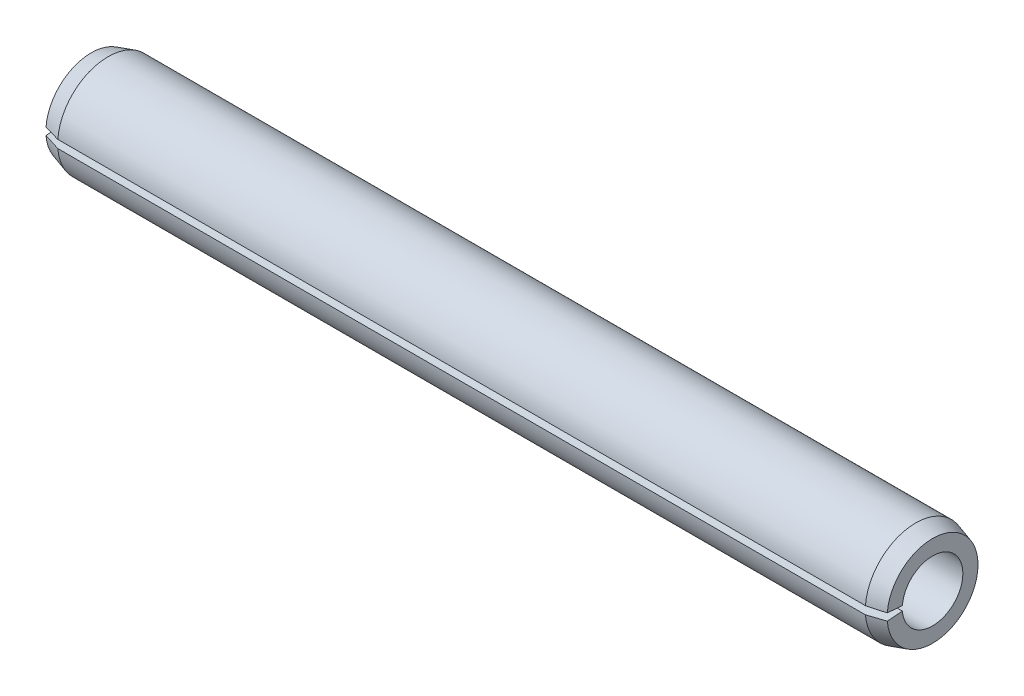
ISO-10303-21;
HEADER;
FILE_DESCRIPTION(('STEP AP214'),'2;1');
FILE_NAME('part.step','',(''),(''),'','','');
FILE_SCHEMA(('AUTOMOTIVE_DESIGN { 1 0 10303 214 1 1 1 1 }'));
ENDSEC;
DATA;
#1=APPLICATION_CONTEXT('core data for automotive mechanical design processes');
#2=APPLICATION_PROTOCOL_DEFINITION('international standard','automotive_design',2000,#1);
#3=PRODUCT_CONTEXT('',#1,'mechanical');
#4=PRODUCT('Part','Part','',(#3));
#5=PRODUCT_RELATED_PRODUCT_CATEGORY('part','',(#4));
#6=PRODUCT_DEFINITION_FORMATION('','',#4);
#7=PRODUCT_DEFINITION_CONTEXT('part definition',#1,'design');
#8=PRODUCT_DEFINITION('design','',#6,#7);
#9=PRODUCT_DEFINITION_SHAPE('','',#8);
#10=(LENGTH_UNIT() NAMED_UNIT(*) SI_UNIT(.MILLI.,.METRE.));
#11=(NAMED_UNIT(*) PLANE_ANGLE_UNIT() SI_UNIT($,.RADIAN.));
#12=(NAMED_UNIT(*) SI_UNIT($,.STERADIAN.) SOLID_ANGLE_UNIT());
#13=UNCERTAINTY_MEASURE_WITH_UNIT(LENGTH_MEASURE(1.E-05),#10,'distance_accuracy_value','');
#14=(GEOMETRIC_REPRESENTATION_CONTEXT(3) GLOBAL_UNCERTAINTY_ASSIGNED_CONTEXT((#13)) GLOBAL_UNIT_ASSIGNED_CONTEXT((#10,
#11,#12)) REPRESENTATION_CONTEXT('',''));
#15=CARTESIAN_POINT('',(0.,0.,0.));
#16=DIRECTION('',(0.,0.,1.));
#17=DIRECTION('',(1.,0.,0.));
#18=AXIS2_PLACEMENT_3D('',#15,#16,#17);
#19=CARTESIAN_POINT('',(0.,1.35,0.));
#20=DIRECTION('',(1.,0.,0.));
#21=DIRECTION('',(0.,0.,-1.));
#22=AXIS2_PLACEMENT_3D('',#19,#20,#21);
#23=PLANE('',#22);
#24=DIRECTION('',(0.,0.0784590957278456,0.996917333733128));
#25=VECTOR('',#24,1.);
#26=CARTESIAN_POINT('',(0.,0.,0.));
#27=LINE('',#26,#25);
#28=CARTESIAN_POINT('',(0.,0.070613186155061,0.897225600359815));
#29=VERTEX_POINT('',#28);
#30=CARTESIAN_POINT('',(0.,0.105919779232592,1.34583840053972));
#31=VERTEX_POINT('',#30);
#32=EDGE_CURVE('E82',#29,#31,#27,.T.);
#33=ORIENTED_EDGE('',*,*,#32,.T.);
#34=CARTESIAN_POINT('',(0.,0.,0.));
#35=DIRECTION('',(-1.,0.,0.));
#36=DIRECTION('',(0.,0.,1.));
#37=AXIS2_PLACEMENT_3D('',#34,#35,#36);
#38=CIRCLE('',#37,1.35);
#39=CARTESIAN_POINT('',(0.,-0.105919779232592,1.34583840053972));
#40=VERTEX_POINT('',#39);
#41=EDGE_CURVE('E100',#31,#40,#38,.T.);
#42=ORIENTED_EDGE('',*,*,#41,.T.);
#43=DIRECTION('',(0.,-0.0784590957278456,0.996917333733128));
#44=VECTOR('',#43,1.);
#45=CARTESIAN_POINT('',(0.,0.,0.));
#46=LINE('',#45,#44);
#47=CARTESIAN_POINT('',(0.,-0.070613186155061,0.897225600359815));
#48=VERTEX_POINT('',#47);
#49=EDGE_CURVE('E54',#48,#40,#46,.T.);
#50=ORIENTED_EDGE('',*,*,#49,.F.);
#51=CARTESIAN_POINT('',(0.,0.,0.));
#52=DIRECTION('',(-1.,0.,0.));
#53=DIRECTION('',(0.,0.,1.));
#54=AXIS2_PLACEMENT_3D('',#51,#52,#53);
#55=CIRCLE('',#54,0.9);
#56=EDGE_CURVE('E97',#29,#48,#55,.T.);
#57=ORIENTED_EDGE('',*,*,#56,.F.);
#58=EDGE_LOOP('',(#33,#42,#50,#57));
#59=FACE_BOUND('',#58,.T.);
#60=ADVANCED_FACE('F33',(#59),#23,.F.);
#61=CARTESIAN_POINT('',(-9.52499999999999,0.,0.));
#62=DIRECTION('',(-1.,0.,0.));
#63=DIRECTION('',(0.,0.,1.));
#64=AXIS2_PLACEMENT_3D('',#61,#62,#63);
#65=CYLINDRICAL_SURFACE('',#64,0.9);
#66=DIRECTION('',(-1.,0.,0.));
#67=VECTOR('',#66,1.);
#68=CARTESIAN_POINT('',(-9.52499999999999,0.070613186155061,0.897225600359815));
#69=LINE('',#68,#67);
#70=CARTESIAN_POINT('',(25.,0.070613186155061,0.897225600359815));
#71=VERTEX_POINT('',#70);
#72=EDGE_CURVE('E85',#29,#71,#69,.F.);
#73=ORIENTED_EDGE('',*,*,#72,.F.);
#74=ORIENTED_EDGE('',*,*,#56,.T.);
#75=DIRECTION('',(-1.,0.,0.));
#76=VECTOR('',#75,1.);
#77=CARTESIAN_POINT('',(-9.52499999999999,-0.070613186155061,0.897225600359815));
#78=LINE('',#77,#76);
#79=CARTESIAN_POINT('',(25.,-0.070613186155061,0.897225600359815));
#80=VERTEX_POINT('',#79);
#81=EDGE_CURVE('E118',#48,#80,#78,.F.);
#82=ORIENTED_EDGE('',*,*,#81,.T.);
#83=CARTESIAN_POINT('',(25.,0.,0.));
#84=DIRECTION('',(-1.,0.,0.));
#85=DIRECTION('',(0.,0.,1.));
#86=AXIS2_PLACEMENT_3D('',#83,#84,#85);
#87=CIRCLE('',#86,0.9);
#88=EDGE_CURVE('E99',#71,#80,#87,.T.);
#89=ORIENTED_EDGE('',*,*,#88,.F.);
#90=EDGE_LOOP('',(#73,#74,#82,#89));
#91=FACE_BOUND('',#90,.T.);
#92=ADVANCED_FACE('F95',(#91),#65,.F.);
#93=CARTESIAN_POINT('',(25.,0.9,0.));
#94=DIRECTION('',(-1.,0.,0.));
#95=DIRECTION('',(0.,0.,1.));
#96=AXIS2_PLACEMENT_3D('',#93,#94,#95);
#97=PLANE('',#96);
#98=DIRECTION('',(0.,0.0784590957278456,0.996917333733128));
#99=VECTOR('',#98,1.);
#100=CARTESIAN_POINT('',(25.,0.,0.));
#101=LINE('',#100,#99);
#102=CARTESIAN_POINT('',(25.,0.105919779232592,1.34583840053972));
#103=VERTEX_POINT('',#102);
#104=EDGE_CURVE('E127',#71,#103,#101,.T.);
#105=ORIENTED_EDGE('',*,*,#104,.F.);
#106=ORIENTED_EDGE('',*,*,#88,.T.);
#107=DIRECTION('',(0.,-0.0784590957278456,0.996917333733128));
#108=VECTOR('',#107,1.);
#109=CARTESIAN_POINT('',(25.,0.,0.));
#110=LINE('',#109,#108);
#111=CARTESIAN_POINT('',(25.,-0.105919779232592,1.34583840053972));
#112=VERTEX_POINT('',#111);
#113=EDGE_CURVE('E126',#80,#112,#110,.T.);
#114=ORIENTED_EDGE('',*,*,#113,.T.);
#115=CARTESIAN_POINT('',(25.,0.,0.));
#116=DIRECTION('',(-1.,0.,0.));
#117=DIRECTION('',(0.,0.,1.));
#118=AXIS2_PLACEMENT_3D('',#115,#116,#117);
#119=CIRCLE('',#118,1.35);
#120=EDGE_CURVE('E104',#103,#112,#119,.T.);
#121=ORIENTED_EDGE('',*,*,#120,.F.);
#122=EDGE_LOOP('',(#105,#106,#114,#121));
#123=FACE_BOUND('',#122,.T.);
#124=ADVANCED_FACE('F137',(#123),#97,.F.);
#125=CARTESIAN_POINT('',(25.,0.,0.));
#126=DIRECTION('',(-1.,0.,0.));
#127=DIRECTION('',(0.,0.,1.));
#128=AXIS2_PLACEMENT_3D('',#125,#126,#127);
#129=CONICAL_SURFACE('',#128,1.35,0.291456794477872);
#130=DIRECTION('',(-0.95782628522115,0.0225450552608443,0.286462087932658));
#131=VECTOR('',#130,1.);
#132=CARTESIAN_POINT('',(29.4999999999999,0.,0.));
#133=LINE('',#132,#131);
#134=CARTESIAN_POINT('',(24.5,0.117688643591769,1.49537600059969));
#135=VERTEX_POINT('',#134);
#136=EDGE_CURVE('E101',#103,#135,#133,.T.);
#137=ORIENTED_EDGE('',*,*,#136,.F.);
#138=ORIENTED_EDGE('',*,*,#120,.T.);
#139=DIRECTION('',(-0.95782628522115,-0.0225450552608443,0.286462087932658));
#140=VECTOR('',#139,1.);
#141=CARTESIAN_POINT('',(29.4999999999999,0.,0.));
#142=LINE('',#141,#140);
#143=CARTESIAN_POINT('',(24.5,-0.117688643591769,1.49537600059969));
#144=VERTEX_POINT('',#143);
#145=EDGE_CURVE('E120',#112,#144,#142,.T.);
#146=ORIENTED_EDGE('',*,*,#145,.T.);
#147=CARTESIAN_POINT('',(24.5,0.,0.));
#148=DIRECTION('',(-1.,0.,0.));
#149=DIRECTION('',(0.,0.,1.));
#150=AXIS2_PLACEMENT_3D('',#147,#148,#149);
#151=CIRCLE('',#150,1.5);
#152=EDGE_CURVE('E109',#135,#144,#151,.T.);
#153=ORIENTED_EDGE('',*,*,#152,.F.);
#154=EDGE_LOOP('',(#137,#138,#146,#153));
#155=FACE_BOUND('',#154,.T.);
#156=ADVANCED_FACE('F136',(#155),#129,.T.);
#157=CARTESIAN_POINT('',(-9.52499999999999,0.,0.));
#158=DIRECTION('',(-1.,0.,0.));
#159=DIRECTION('',(0.,0.,1.));
#160=AXIS2_PLACEMENT_3D('',#157,#158,#159);
#161=CYLINDRICAL_SURFACE('',#160,1.5);
#162=DIRECTION('',(-1.,0.,0.));
#163=VECTOR('',#162,1.);
#164=CARTESIAN_POINT('',(-9.52499999999999,0.117688643591769,1.49537600059969));
#165=LINE('',#164,#163);
#166=CARTESIAN_POINT('',(0.5,0.117688643591768,1.49537600059969));
#167=VERTEX_POINT('',#166);
#168=EDGE_CURVE('E46',#135,#167,#165,.T.);
#169=ORIENTED_EDGE('',*,*,#168,.F.);
#170=ORIENTED_EDGE('',*,*,#152,.T.);
#171=DIRECTION('',(-1.,0.,0.));
#172=VECTOR('',#171,1.);
#173=CARTESIAN_POINT('',(-9.52499999999999,-0.117688643591769,1.49537600059969));
#174=LINE('',#173,#172);
#175=CARTESIAN_POINT('',(0.5,-0.117688643591768,1.49537600059969));
#176=VERTEX_POINT('',#175);
#177=EDGE_CURVE('E123',#144,#176,#174,.T.);
#178=ORIENTED_EDGE('',*,*,#177,.T.);
#179=CARTESIAN_POINT('',(0.5,0.,0.));
#180=DIRECTION('',(-1.,0.,0.));
#181=DIRECTION('',(0.,0.,1.));
#182=AXIS2_PLACEMENT_3D('',#179,#180,#181);
#183=CIRCLE('',#182,1.5);
#184=EDGE_CURVE('E112',#167,#176,#183,.T.);
#185=ORIENTED_EDGE('',*,*,#184,.F.);
#186=EDGE_LOOP('',(#169,#170,#178,#185));
#187=FACE_BOUND('',#186,.T.);
#188=ADVANCED_FACE('F140',(#187),#161,.T.);
#189=CARTESIAN_POINT('',(0.5,0.,0.));
#190=DIRECTION('',(1.,0.,0.));
#191=DIRECTION('',(0.,0.,-1.));
#192=AXIS2_PLACEMENT_3D('',#189,#190,#191);
#193=CONICAL_SURFACE('',#192,1.5,0.291456794477867);
#194=DIRECTION('',(-0.957826285221152,-0.0225450552608439,-0.286462087932653));
#195=VECTOR('',#194,1.);
#196=CARTESIAN_POINT('',(-4.50000000000001,0.,0.));
#197=LINE('',#196,#195);
#198=EDGE_CURVE('E11',#167,#31,#197,.T.);
#199=ORIENTED_EDGE('',*,*,#198,.F.);
#200=ORIENTED_EDGE('',*,*,#184,.T.);
#201=DIRECTION('',(-0.957826285221152,0.0225450552608439,-0.286462087932653));
#202=VECTOR('',#201,1.);
#203=CARTESIAN_POINT('',(-4.50000000000001,0.,0.));
#204=LINE('',#203,#202);
#205=EDGE_CURVE('E40',#176,#40,#204,.T.);
#206=ORIENTED_EDGE('',*,*,#205,.T.);
#207=ORIENTED_EDGE('',*,*,#41,.F.);
#208=EDGE_LOOP('',(#199,#200,#206,#207));
#209=FACE_BOUND('',#208,.T.);
#210=ADVANCED_FACE('F143',(#209),#193,.T.);
#211=CARTESIAN_POINT('',(25.,0.,0.));
#212=DIRECTION('',(0.,-0.996917333733128,-0.0784590957278456));
#213=DIRECTION('',(0.,0.0784590957278456,-0.996917333733128));
#214=AXIS2_PLACEMENT_3D('',#211,#212,#213);
#215=PLANE('',#214);
#216=ORIENTED_EDGE('',*,*,#49,.T.);
#217=ORIENTED_EDGE('',*,*,#205,.F.);
#218=ORIENTED_EDGE('',*,*,#177,.F.);
#219=ORIENTED_EDGE('',*,*,#145,.F.);
#220=ORIENTED_EDGE('',*,*,#113,.F.);
#221=ORIENTED_EDGE('',*,*,#81,.F.);
#222=EDGE_LOOP('',(#216,#217,#218,#219,#220,#221));
#223=FACE_BOUND('',#222,.T.);
#224=ADVANCED_FACE('F138',(#223),#215,.F.);
#225=CARTESIAN_POINT('',(25.,0.,0.));
#226=DIRECTION('',(0.,-0.996917333733128,0.0784590957278456));
#227=DIRECTION('',(0.,-0.0784590957278456,-0.996917333733128));
#228=AXIS2_PLACEMENT_3D('',#225,#226,#227);
#229=PLANE('',#228);
#230=ORIENTED_EDGE('',*,*,#72,.T.);
#231=ORIENTED_EDGE('',*,*,#104,.T.);
#232=ORIENTED_EDGE('',*,*,#136,.T.);
#233=ORIENTED_EDGE('',*,*,#168,.T.);
#234=ORIENTED_EDGE('',*,*,#198,.T.);
#235=ORIENTED_EDGE('',*,*,#32,.F.);
#236=EDGE_LOOP('',(#230,#231,#232,#233,#234,#235));
#237=FACE_BOUND('',#236,.T.);
#238=ADVANCED_FACE('F84',(#237),#229,.T.);
#239=CLOSED_SHELL('',(#60,#92,#124,#156,#188,#210,#224,#238));
#240=MANIFOLD_SOLID_BREP('B2',#239);
#241=ADVANCED_BREP_SHAPE_REPRESENTATION('',(#18,#240),#14);
#242=SHAPE_DEFINITION_REPRESENTATION(#9,#241);
ENDSEC;
END-ISO-10303-21;
